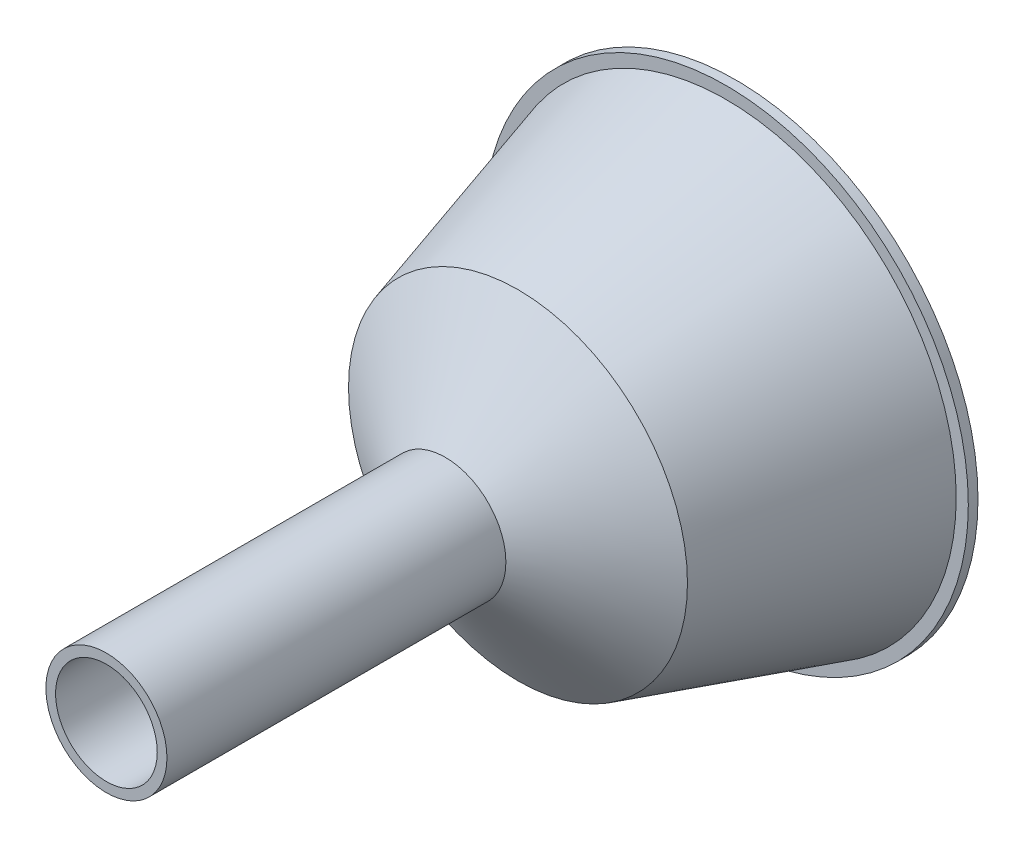
ISO-10303-21;
HEADER;
FILE_DESCRIPTION(('STEP AP214'),'2;1');
FILE_NAME('part.step','',(''),(''),'','','');
FILE_SCHEMA(('AUTOMOTIVE_DESIGN { 1 0 10303 214 1 1 1 1 }'));
ENDSEC;
DATA;
#1=APPLICATION_CONTEXT('core data for automotive mechanical design processes');
#2=APPLICATION_PROTOCOL_DEFINITION('international standard','automotive_design',2000,#1);
#3=PRODUCT_CONTEXT('',#1,'mechanical');
#4=PRODUCT('Part','Part','',(#3));
#5=PRODUCT_RELATED_PRODUCT_CATEGORY('part','',(#4));
#6=PRODUCT_DEFINITION_FORMATION('','',#4);
#7=PRODUCT_DEFINITION_CONTEXT('part definition',#1,'design');
#8=PRODUCT_DEFINITION('design','',#6,#7);
#9=PRODUCT_DEFINITION_SHAPE('','',#8);
#10=(LENGTH_UNIT() NAMED_UNIT(*) SI_UNIT(.MILLI.,.METRE.));
#11=(NAMED_UNIT(*) PLANE_ANGLE_UNIT() SI_UNIT($,.RADIAN.));
#12=(NAMED_UNIT(*) SI_UNIT($,.STERADIAN.) SOLID_ANGLE_UNIT());
#13=UNCERTAINTY_MEASURE_WITH_UNIT(LENGTH_MEASURE(1.E-05),#10,'distance_accuracy_value','');
#14=(GEOMETRIC_REPRESENTATION_CONTEXT(3) GLOBAL_UNCERTAINTY_ASSIGNED_CONTEXT((#13)) GLOBAL_UNIT_ASSIGNED_CONTEXT((#10,
#11,#12)) REPRESENTATION_CONTEXT('',''));
#15=CARTESIAN_POINT('',(0.,0.,0.));
#16=DIRECTION('',(0.,0.,1.));
#17=DIRECTION('',(1.,0.,0.));
#18=AXIS2_PLACEMENT_3D('',#15,#16,#17);
#19=CARTESIAN_POINT('',(0.,0.,65.));
#20=DIRECTION('',(0.,0.,1.));
#21=DIRECTION('',(1.,0.,0.));
#22=AXIS2_PLACEMENT_3D('',#19,#20,#21);
#23=CYLINDRICAL_SURFACE('',#22,50.);
#24=CARTESIAN_POINT('',(0.,0.,-65.));
#25=DIRECTION('',(0.,0.,1.));
#26=DIRECTION('',(1.,0.,0.));
#27=AXIS2_PLACEMENT_3D('',#24,#25,#26);
#28=CIRCLE('',#27,50.);
#29=CARTESIAN_POINT('',(50.,0.,-65.));
#30=VERTEX_POINT('',#29);
#31=EDGE_CURVE('E53',#30,#30,#28,.T.);
#32=ORIENTED_EDGE('',*,*,#31,.T.);
#33=EDGE_LOOP('',(#32));
#34=FACE_BOUND('',#33,.T.);
#35=CARTESIAN_POINT('',(0.,0.,-63.));
#36=DIRECTION('',(0.,0.,1.));
#37=DIRECTION('',(1.,0.,0.));
#38=AXIS2_PLACEMENT_3D('',#35,#36,#37);
#39=CIRCLE('',#38,50.);
#40=CARTESIAN_POINT('',(50.,0.,-63.));
#41=VERTEX_POINT('',#40);
#42=EDGE_CURVE('E10',#41,#41,#39,.T.);
#43=ORIENTED_EDGE('',*,*,#42,.F.);
#44=EDGE_LOOP('',(#43));
#45=FACE_BOUND('',#44,.T.);
#46=ADVANCED_FACE('F31',(#34,#45),#23,.T.);
#47=CARTESIAN_POINT('',(50.,0.,-63.));
#48=DIRECTION('',(0.,0.,1.));
#49=DIRECTION('',(1.,0.,0.));
#50=AXIS2_PLACEMENT_3D('',#47,#48,#49);
#51=PLANE('',#50);
#52=ORIENTED_EDGE('',*,*,#42,.T.);
#53=EDGE_LOOP('',(#52));
#54=FACE_BOUND('',#53,.T.);
#55=CARTESIAN_POINT('',(0.,0.,-63.));
#56=DIRECTION('',(0.,0.,1.));
#57=DIRECTION('',(1.,0.,0.));
#58=AXIS2_PLACEMENT_3D('',#55,#56,#57);
#59=CIRCLE('',#58,47.5);
#60=CARTESIAN_POINT('',(47.5,0.,-63.));
#61=VERTEX_POINT('',#60);
#62=EDGE_CURVE('E37',#61,#61,#59,.T.);
#63=ORIENTED_EDGE('',*,*,#62,.F.);
#64=EDGE_LOOP('',(#63));
#65=FACE_BOUND('',#64,.T.);
#66=ADVANCED_FACE('F108',(#54,#65),#51,.T.);
#67=CARTESIAN_POINT('',(0.,0.,-20.));
#68=DIRECTION('',(0.,0.,-1.));
#69=DIRECTION('',(-1.,0.,0.));
#70=AXIS2_PLACEMENT_3D('',#67,#68,#69);
#71=CONICAL_SURFACE('',#70,35.,0.282900853528085);
#72=ORIENTED_EDGE('',*,*,#62,.T.);
#73=EDGE_LOOP('',(#72));
#74=FACE_BOUND('',#73,.T.);
#75=CARTESIAN_POINT('',(0.,0.,-20.));
#76=DIRECTION('',(0.,0.,1.));
#77=DIRECTION('',(1.,0.,0.));
#78=AXIS2_PLACEMENT_3D('',#75,#76,#77);
#79=CIRCLE('',#78,35.);
#80=CARTESIAN_POINT('',(35.,0.,-20.));
#81=VERTEX_POINT('',#80);
#82=EDGE_CURVE('E41',#81,#81,#79,.T.);
#83=ORIENTED_EDGE('',*,*,#82,.F.);
#84=EDGE_LOOP('',(#83));
#85=FACE_BOUND('',#84,.T.);
#86=ADVANCED_FACE('F104',(#74,#85),#71,.T.);
#87=CARTESIAN_POINT('',(0.,0.,-5.));
#88=DIRECTION('',(0.,0.,-1.));
#89=DIRECTION('',(-1.,0.,0.));
#90=AXIS2_PLACEMENT_3D('',#87,#88,#89);
#91=CONICAL_SURFACE('',#90,12.5,0.982793723247329);
#92=ORIENTED_EDGE('',*,*,#82,.T.);
#93=EDGE_LOOP('',(#92));
#94=FACE_BOUND('',#93,.T.);
#95=CARTESIAN_POINT('',(0.,0.,-5.));
#96=DIRECTION('',(0.,0.,1.));
#97=DIRECTION('',(1.,0.,0.));
#98=AXIS2_PLACEMENT_3D('',#95,#96,#97);
#99=CIRCLE('',#98,12.5);
#100=CARTESIAN_POINT('',(12.5,0.,-5.00000000000001));
#101=VERTEX_POINT('',#100);
#102=EDGE_CURVE('E45',#101,#101,#99,.T.);
#103=ORIENTED_EDGE('',*,*,#102,.F.);
#104=EDGE_LOOP('',(#103));
#105=FACE_BOUND('',#104,.T.);
#106=ADVANCED_FACE('F98',(#94,#105),#91,.T.);
#107=CARTESIAN_POINT('',(0.,0.,65.));
#108=DIRECTION('',(0.,0.,1.));
#109=DIRECTION('',(1.,0.,0.));
#110=AXIS2_PLACEMENT_3D('',#107,#108,#109);
#111=CYLINDRICAL_SURFACE('',#110,12.5);
#112=ORIENTED_EDGE('',*,*,#102,.T.);
#113=EDGE_LOOP('',(#112));
#114=FACE_BOUND('',#113,.T.);
#115=CARTESIAN_POINT('',(0.,0.,65.));
#116=DIRECTION('',(0.,0.,1.));
#117=DIRECTION('',(1.,0.,0.));
#118=AXIS2_PLACEMENT_3D('',#115,#116,#117);
#119=CIRCLE('',#118,12.5);
#120=CARTESIAN_POINT('',(12.5,0.,65.));
#121=VERTEX_POINT('',#120);
#122=EDGE_CURVE('E50',#121,#121,#119,.T.);
#123=ORIENTED_EDGE('',*,*,#122,.F.);
#124=EDGE_LOOP('',(#123));
#125=FACE_BOUND('',#124,.T.);
#126=ADVANCED_FACE('F93',(#114,#125),#111,.T.);
#127=CARTESIAN_POINT('',(0.,0.,65.));
#128=DIRECTION('',(0.,0.,1.));
#129=DIRECTION('',(1.,0.,0.));
#130=AXIS2_PLACEMENT_3D('',#127,#128,#129);
#131=PLANE('',#130);
#132=CARTESIAN_POINT('',(0.,0.,65.));
#133=DIRECTION('',(0.,0.,1.));
#134=DIRECTION('',(1.,0.,0.));
#135=AXIS2_PLACEMENT_3D('',#132,#133,#134);
#136=CIRCLE('',#135,10.5);
#137=CARTESIAN_POINT('',(10.5,0.,65.));
#138=VERTEX_POINT('',#137);
#139=EDGE_CURVE('E57',#138,#138,#136,.T.);
#140=ORIENTED_EDGE('',*,*,#139,.F.);
#141=EDGE_LOOP('',(#140));
#142=FACE_BOUND('',#141,.T.);
#143=ORIENTED_EDGE('',*,*,#122,.T.);
#144=EDGE_LOOP('',(#143));
#145=FACE_BOUND('',#144,.T.);
#146=ADVANCED_FACE('F90',(#142,#145),#131,.T.);
#147=CARTESIAN_POINT('',(0.,0.,-65.));
#148=DIRECTION('',(0.,0.,-1.));
#149=DIRECTION('',(-1.,0.,0.));
#150=AXIS2_PLACEMENT_3D('',#147,#148,#149);
#151=PLANE('',#150);
#152=CARTESIAN_POINT('',(0.,0.,-65.));
#153=DIRECTION('',(0.,0.,1.));
#154=DIRECTION('',(1.,0.,0.));
#155=AXIS2_PLACEMENT_3D('',#152,#153,#154);
#156=CIRCLE('',#155,45.9986038202272);
#157=CARTESIAN_POINT('',(45.9986038202272,0.,-65.));
#158=VERTEX_POINT('',#157);
#159=EDGE_CURVE('E56',#158,#158,#156,.T.);
#160=ORIENTED_EDGE('',*,*,#159,.T.);
#161=EDGE_LOOP('',(#160));
#162=FACE_BOUND('',#161,.T.);
#163=ORIENTED_EDGE('',*,*,#31,.F.);
#164=EDGE_LOOP('',(#163));
#165=FACE_BOUND('',#164,.T.);
#166=ADVANCED_FACE('F69',(#162,#165),#151,.T.);
#167=CARTESIAN_POINT('',(0.,0.,-20.5582847259084));
#168=DIRECTION('',(0.,0.,-1.));
#169=DIRECTION('',(-1.,0.,0.));
#170=AXIS2_PLACEMENT_3D('',#167,#168,#169);
#171=CONICAL_SURFACE('',#170,33.079500542875,0.282900853528085);
#172=ORIENTED_EDGE('',*,*,#159,.F.);
#173=EDGE_LOOP('',(#172));
#174=FACE_BOUND('',#173,.T.);
#175=CARTESIAN_POINT('',(0.,0.,-21.2592051752831));
#176=DIRECTION('',(0.,0.,1.));
#177=DIRECTION('',(1.,0.,0.));
#178=AXIS2_PLACEMENT_3D('',#175,#176,#177);
#179=CIRCLE('',#178,33.2832564874607);
#180=CARTESIAN_POINT('',(-33.2832564874607,0.,-21.2592051752831));
#181=VERTEX_POINT('',#180);
#182=EDGE_CURVE('E63',#181,#181,#179,.T.);
#183=ORIENTED_EDGE('',*,*,#182,.T.);
#184=EDGE_LOOP('',(#183));
#185=FACE_BOUND('',#184,.T.);
#186=ADVANCED_FACE('F72',(#174,#185),#171,.F.);
#187=CARTESIAN_POINT('',(0.,0.,-6.66410058867569));
#188=DIRECTION('',(0.,0.,-1.));
#189=DIRECTION('',(-1.,0.,0.));
#190=AXIS2_PLACEMENT_3D('',#187,#188,#189);
#191=CONICAL_SURFACE('',#190,11.3905996075496,0.982793723247329);
#192=CARTESIAN_POINT('',(0.,0.,-6.07036751697599));
#193=DIRECTION('',(0.,0.,-1.));
#194=DIRECTION('',(-1.,0.,0.));
#195=AXIS2_PLACEMENT_3D('',#192,#193,#194);
#196=CIRCLE('',#195,10.5);
#197=CARTESIAN_POINT('',(-10.5,0.,-6.07036751697599));
#198=VERTEX_POINT('',#197);
#199=EDGE_CURVE('E60',#198,#198,#196,.F.);
#200=CARTESIAN_POINT('',(-33.2832564874607,0.,-21.2592051752831));
#201=CARTESIAN_POINT('',(-33.0459308990497,0.,-21.1009881163424));
#202=CARTESIAN_POINT('',(-32.8086053106386,0.,-20.9427710574017));
#203=CARTESIAN_POINT('',(-32.3339541338165,0.,-20.6263369395203));
#204=CARTESIAN_POINT('',(-32.0966285454055,0.,-20.4681198805796));
#205=CARTESIAN_POINT('',(-31.6219773685834,0.,-20.1516857626982));
#206=CARTESIAN_POINT('',(-31.3846517801723,0.,-19.9934687037575));
#207=CARTESIAN_POINT('',(-30.9100006033502,0.,-19.6770345858761));
#208=CARTESIAN_POINT('',(-30.6726750149392,0.,-19.5188175269354));
#209=CARTESIAN_POINT('',(-30.1980238381171,0.,-19.202383409054));
#210=CARTESIAN_POINT('',(-29.960698249706,0.,-19.0441663501133));
#211=CARTESIAN_POINT('',(-29.4860470728839,0.,-18.7277322322319));
#212=CARTESIAN_POINT('',(-29.2487214844729,0.,-18.5695151732912));
#213=CARTESIAN_POINT('',(-28.7740703076508,0.,-18.2530810554098));
#214=CARTESIAN_POINT('',(-28.5367447192397,0.,-18.0948639964691));
#215=CARTESIAN_POINT('',(-28.0620935424176,0.,-17.7784298785877));
#216=CARTESIAN_POINT('',(-27.8247679540066,0.,-17.620212819647));
#217=CARTESIAN_POINT('',(-27.3501167771845,0.,-17.3037787017656));
#218=CARTESIAN_POINT('',(-27.1127911887734,0.,-17.1455616428249));
#219=CARTESIAN_POINT('',(-26.6381400119513,0.,-16.8291275249435));
#220=CARTESIAN_POINT('',(-26.4008144235403,0.,-16.6709104660028));
#221=CARTESIAN_POINT('',(-25.9261632467182,0.,-16.3544763481214));
#222=CARTESIAN_POINT('',(-25.6888376583071,0.,-16.1962592891807));
#223=CARTESIAN_POINT('',(-25.2141864814851,0.,-15.8798251712993));
#224=CARTESIAN_POINT('',(-24.976860893074,0.,-15.7216081123586));
#225=CARTESIAN_POINT('',(-24.5022097162519,0.,-15.4051739944772));
#226=CARTESIAN_POINT('',(-24.2648841278409,0.,-15.2469569355365));
#227=CARTESIAN_POINT('',(-23.7902329510188,0.,-14.9305228176551));
#228=CARTESIAN_POINT('',(-23.5529073626077,0.,-14.7723057587144));
#229=CARTESIAN_POINT('',(-23.0782561857856,0.,-14.455871640833));
#230=CARTESIAN_POINT('',(-22.8409305973746,0.,-14.2976545818923));
#231=CARTESIAN_POINT('',(-22.3662794205525,0.,-13.981220464011));
#232=CARTESIAN_POINT('',(-22.1289538321414,0.,-13.8230034050703));
#233=CARTESIAN_POINT('',(-21.6543026553193,0.,-13.5065692871889));
#234=CARTESIAN_POINT('',(-21.4169770669083,0.,-13.3483522282482));
#235=CARTESIAN_POINT('',(-20.9423258900862,0.,-13.0319181103668));
#236=CARTESIAN_POINT('',(-20.7050003016751,0.,-12.8737010514261));
#237=CARTESIAN_POINT('',(-20.230349124853,0.,-12.5572669335447));
#238=CARTESIAN_POINT('',(-19.993023536442,0.,-12.399049874604));
#239=CARTESIAN_POINT('',(-19.5183723596199,0.,-12.0826157567226));
#240=CARTESIAN_POINT('',(-19.2810467712088,0.,-11.9243986977819));
#241=CARTESIAN_POINT('',(-18.8063955943867,0.,-11.6079645799005));
#242=CARTESIAN_POINT('',(-18.5690700059757,0.,-11.4497475209598));
#243=CARTESIAN_POINT('',(-18.0944188291536,0.,-11.1333134030784));
#244=CARTESIAN_POINT('',(-17.8570932407425,0.,-10.9750963441377));
#245=CARTESIAN_POINT('',(-17.3824420639204,0.,-10.6586622262563));
#246=CARTESIAN_POINT('',(-17.1451164755094,0.,-10.5004451673156));
#247=CARTESIAN_POINT('',(-16.6704652986873,0.,-10.1840110494342));
#248=CARTESIAN_POINT('',(-16.4331397102762,0.,-10.0257939904935));
#249=CARTESIAN_POINT('',(-15.9584885334541,0.,-9.70935987261207));
#250=CARTESIAN_POINT('',(-15.7211629450431,0.,-9.55114281367137));
#251=CARTESIAN_POINT('',(-15.246511768221,0.,-9.23470869578997));
#252=CARTESIAN_POINT('',(-15.0091861798099,0.,-9.07649163684927));
#253=CARTESIAN_POINT('',(-14.5345350029878,0.,-8.76005751896788));
#254=CARTESIAN_POINT('',(-14.2972094145768,0.,-8.60184046002718));
#255=CARTESIAN_POINT('',(-13.8225582377547,0.,-8.28540634214578));
#256=CARTESIAN_POINT('',(-13.5852326493437,0.,-8.12718928320508));
#257=CARTESIAN_POINT('',(-13.1105814725216,0.,-7.81075516532368));
#258=CARTESIAN_POINT('',(-12.8732558841105,0.,-7.65253810638298));
#259=CARTESIAN_POINT('',(-12.3986047072884,0.,-7.33610398850158));
#260=CARTESIAN_POINT('',(-12.1612791188774,0.,-7.17788692956088));
#261=CARTESIAN_POINT('',(-11.6866279420553,0.,-6.86145281167949));
#262=CARTESIAN_POINT('',(-11.4493023536442,0.,-6.70323575273879));
#263=CARTESIAN_POINT('',(-10.9746511768221,0.,-6.38680163485739));
#264=CARTESIAN_POINT('',(-10.7373255884111,0.,-6.22858457591669));
#265=CARTESIAN_POINT('',(-10.5,0.,-6.07036751697599));
#266=B_SPLINE_CURVE_WITH_KNOTS('',3,(#200,#201,#202,#203,#204,#205,#206,#207,#208,#209,#210,
#211,#212,#213,#214,#215,#216,#217,#218,#219,#220,#221,#222,#223,#224,#225,#226,#227,#228,#229,
#230,#231,#232,#233,#234,#235,#236,#237,#238,#239,#240,#241,#242,#243,#244,#245,#246,#247,#248,
#249,#250,#251,#252,#253,#254,#255,#256,#257,#258,#259,#260,#261,#262,#263,#264,#265),
.UNSPECIFIED.,.F.,.F.,(4,2,2,2,2,2,2,2,2,2,2,2,2,2,2,2,2,2,2,2,2,2,2,2,2,2,2,2,2,2,2,2,4),(0.,
0.855689577995703,1.7113791559914,2.56706873398709,3.42275831198279,4.27844788997849,
5.13413746797419,5.98982704596989,6.84551662396559,7.70120620196129,8.55689577995699,
9.41258535795269,10.2682749359484,11.1239645139441,11.9796540919398,12.8353436699355,
13.6910332479312,14.5467228259269,15.4024124039226,16.2581019819183,17.113791559914,
17.9694811379097,18.8251707159054,19.6808602939011,20.5365498718968,21.3922394498925,
22.2479290278882,23.1036186058839,23.9593081838796,24.8149977618753,25.670687339871,
26.5263769178667,27.3820664958624),.UNSPECIFIED.);
#267=EDGE_CURVE('BSEAM75',#181,#198,#266,.T.);
#268=ORIENTED_EDGE('',*,*,#182,.F.);
#269=ORIENTED_EDGE('',*,*,#199,.T.);
#270=ORIENTED_EDGE('',*,*,#267,.T.);
#271=ORIENTED_EDGE('',*,*,#267,.F.);
#272=EDGE_LOOP('',(#268,#270,#269,#271));
#273=FACE_BOUND('',#272,.T.);
#274=ADVANCED_FACE('F75',(#273),#191,.F.);
#275=CARTESIAN_POINT('',(0.,0.,65.));
#276=DIRECTION('',(0.,0.,1.));
#277=DIRECTION('',(1.,0.,0.));
#278=AXIS2_PLACEMENT_3D('',#275,#276,#277);
#279=CYLINDRICAL_SURFACE('',#278,10.5);
#280=ORIENTED_EDGE('',*,*,#199,.F.);
#281=EDGE_LOOP('',(#280));
#282=FACE_BOUND('',#281,.T.);
#283=ORIENTED_EDGE('',*,*,#139,.T.);
#284=EDGE_LOOP('',(#283));
#285=FACE_BOUND('',#284,.T.);
#286=ADVANCED_FACE('F81',(#282,#285),#279,.F.);
#287=CLOSED_SHELL('',(#46,#66,#86,#106,#126,#146,#166,#186,#274,#286));
#288=MANIFOLD_SOLID_BREP('B2',#287);
#289=ADVANCED_BREP_SHAPE_REPRESENTATION('',(#18,#288),#14);
#290=SHAPE_DEFINITION_REPRESENTATION(#9,#289);
ENDSEC;
END-ISO-10303-21;
